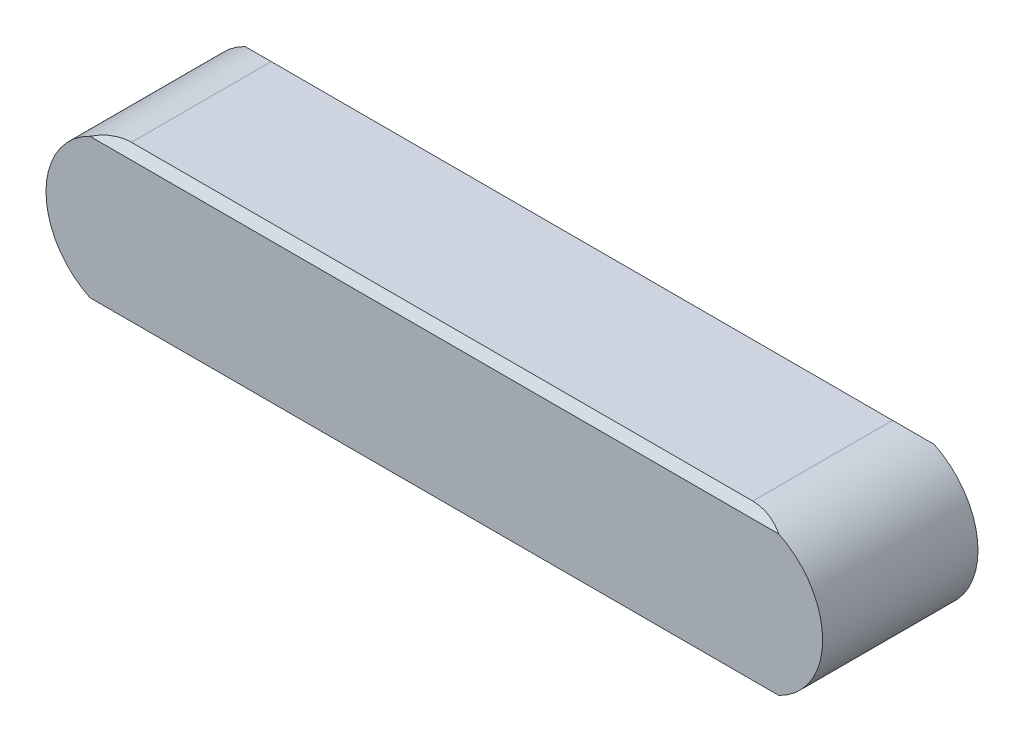
ISO-10303-21;
HEADER;
FILE_DESCRIPTION(('STEP AP214'),'2;1');
FILE_NAME('part.step','',(''),(''),'','','');
FILE_SCHEMA(('AUTOMOTIVE_DESIGN { 1 0 10303 214 1 1 1 1 }'));
ENDSEC;
DATA;
#1=APPLICATION_CONTEXT('core data for automotive mechanical design processes');
#2=APPLICATION_PROTOCOL_DEFINITION('international standard','automotive_design',2000,#1);
#3=PRODUCT_CONTEXT('',#1,'mechanical');
#4=PRODUCT('Part','Part','',(#3));
#5=PRODUCT_RELATED_PRODUCT_CATEGORY('part','',(#4));
#6=PRODUCT_DEFINITION_FORMATION('','',#4);
#7=PRODUCT_DEFINITION_CONTEXT('part definition',#1,'design');
#8=PRODUCT_DEFINITION('design','',#6,#7);
#9=PRODUCT_DEFINITION_SHAPE('','',#8);
#10=(LENGTH_UNIT() NAMED_UNIT(*) SI_UNIT(.MILLI.,.METRE.));
#11=(NAMED_UNIT(*) PLANE_ANGLE_UNIT() SI_UNIT($,.RADIAN.));
#12=(NAMED_UNIT(*) SI_UNIT($,.STERADIAN.) SOLID_ANGLE_UNIT());
#13=UNCERTAINTY_MEASURE_WITH_UNIT(LENGTH_MEASURE(1.E-05),#10,'distance_accuracy_value','');
#14=(GEOMETRIC_REPRESENTATION_CONTEXT(3) GLOBAL_UNCERTAINTY_ASSIGNED_CONTEXT((#13)) GLOBAL_UNIT_ASSIGNED_CONTEXT((#10,
#11,#12)) REPRESENTATION_CONTEXT('',''));
#15=CARTESIAN_POINT('',(0.,0.,0.));
#16=DIRECTION('',(0.,0.,1.));
#17=DIRECTION('',(1.,0.,0.));
#18=AXIS2_PLACEMENT_3D('',#15,#16,#17);
#19=CARTESIAN_POINT('',(0.,3.8,0.));
#20=DIRECTION('',(0.,-0.707106781186547,0.707106781186548));
#21=DIRECTION('',(0.,-0.707106781186548,-0.707106781186547));
#22=AXIS2_PLACEMENT_3D('',#19,#20,#21);
#23=PLANE('',#22);
#24=DIRECTION('',(1.,0.,0.));
#25=VECTOR('',#24,1.);
#26=CARTESIAN_POINT('',(0.,3.8,0.));
#27=LINE('',#26,#25);
#28=CARTESIAN_POINT('',(18.8717797887081,3.8,0.));
#29=VERTEX_POINT('',#28);
#30=CARTESIAN_POINT('',(1.12822021129187,3.8,0.));
#31=VERTEX_POINT('',#30);
#32=EDGE_CURVE('E91',#29,#31,#27,.F.);
#33=ORIENTED_EDGE('',*,*,#32,.T.);
#34=CARTESIAN_POINT('',(2.,2.,-1.8));
#35=DIRECTION('',(0.,-0.707106781186547,0.707106781186548));
#36=DIRECTION('',(0.,-0.707106781186548,-0.707106781186547));
#37=AXIS2_PLACEMENT_3D('',#34,#35,#36);
#38=ELLIPSE('',#37,2.82842712474619,2.);
#39=CARTESIAN_POINT('',(2.,4.,0.2));
#40=VERTEX_POINT('',#39);
#41=EDGE_CURVE('E20',#40,#31,#38,.T.);
#42=ORIENTED_EDGE('',*,*,#41,.F.);
#43=DIRECTION('',(1.,0.,0.));
#44=VECTOR('',#43,1.);
#45=CARTESIAN_POINT('',(2.,4.,0.2));
#46=LINE('',#45,#44);
#47=CARTESIAN_POINT('',(18.,4.,0.2));
#48=VERTEX_POINT('',#47);
#49=EDGE_CURVE('E96',#48,#40,#46,.F.);
#50=ORIENTED_EDGE('',*,*,#49,.F.);
#51=CARTESIAN_POINT('',(18.,2.,-1.8));
#52=DIRECTION('',(0.,-0.707106781186547,0.707106781186548));
#53=DIRECTION('',(0.,-0.707106781186548,-0.707106781186547));
#54=AXIS2_PLACEMENT_3D('',#51,#52,#53);
#55=ELLIPSE('',#54,2.82842712474619,2.);
#56=EDGE_CURVE('E89',#29,#48,#55,.T.);
#57=ORIENTED_EDGE('',*,*,#56,.F.);
#58=EDGE_LOOP('',(#33,#42,#50,#57));
#59=FACE_BOUND('',#58,.T.);
#60=ADVANCED_FACE('F17',(#59),#23,.F.);
#61=CARTESIAN_POINT('',(0.,0.,0.2));
#62=DIRECTION('',(0.,0.707106781186548,0.707106781186547));
#63=DIRECTION('',(0.,-0.707106781186547,0.707106781186548));
#64=AXIS2_PLACEMENT_3D('',#61,#62,#63);
#65=PLANE('',#64);
#66=DIRECTION('',(1.,0.,0.));
#67=VECTOR('',#66,1.);
#68=CARTESIAN_POINT('',(18.,0.,0.2));
#69=LINE('',#68,#67);
#70=CARTESIAN_POINT('',(2.,0.,0.2));
#71=VERTEX_POINT('',#70);
#72=CARTESIAN_POINT('',(18.,0.,0.2));
#73=VERTEX_POINT('',#72);
#74=EDGE_CURVE('E142',#71,#73,#69,.T.);
#75=ORIENTED_EDGE('',*,*,#74,.F.);
#76=CARTESIAN_POINT('',(2.,2.,-1.8));
#77=DIRECTION('',(0.,0.707106781186548,0.707106781186547));
#78=DIRECTION('',(0.,0.707106781186547,-0.707106781186548));
#79=AXIS2_PLACEMENT_3D('',#76,#77,#78);
#80=ELLIPSE('',#79,2.82842712474619,2.);
#81=CARTESIAN_POINT('',(1.12822021129187,0.2,0.));
#82=VERTEX_POINT('',#81);
#83=EDGE_CURVE('E127',#82,#71,#80,.T.);
#84=ORIENTED_EDGE('',*,*,#83,.F.);
#85=DIRECTION('',(1.,0.,0.));
#86=VECTOR('',#85,1.);
#87=CARTESIAN_POINT('',(0.,0.2,0.));
#88=LINE('',#87,#86);
#89=CARTESIAN_POINT('',(18.8717797887081,0.2,0.));
#90=VERTEX_POINT('',#89);
#91=EDGE_CURVE('E95',#82,#90,#88,.T.);
#92=ORIENTED_EDGE('',*,*,#91,.T.);
#93=CARTESIAN_POINT('',(18.,2.,-1.8));
#94=DIRECTION('',(0.,0.707106781186548,0.707106781186547));
#95=DIRECTION('',(0.,0.707106781186547,-0.707106781186548));
#96=AXIS2_PLACEMENT_3D('',#93,#94,#95);
#97=ELLIPSE('',#96,2.82842712474619,2.);
#98=EDGE_CURVE('E125',#73,#90,#97,.T.);
#99=ORIENTED_EDGE('',*,*,#98,.F.);
#100=EDGE_LOOP('',(#75,#84,#92,#99));
#101=FACE_BOUND('',#100,.T.);
#102=ADVANCED_FACE('F147',(#101),#65,.F.);
#103=CARTESIAN_POINT('',(2.,4.,0.));
#104=DIRECTION('',(0.,1.,0.));
#105=DIRECTION('',(0.,0.,1.));
#106=AXIS2_PLACEMENT_3D('',#103,#104,#105);
#107=PLANE('',#106);
#108=ORIENTED_EDGE('',*,*,#49,.T.);
#109=DIRECTION('',(0.,0.,-1.));
#110=VECTOR('',#109,1.);
#111=CARTESIAN_POINT('',(2.,4.,0.));
#112=LINE('',#111,#110);
#113=CARTESIAN_POINT('',(2.,4.,3.8));
#114=VERTEX_POINT('',#113);
#115=EDGE_CURVE('E88',#114,#40,#112,.T.);
#116=ORIENTED_EDGE('',*,*,#115,.F.);
#117=DIRECTION('',(1.,0.,0.));
#118=VECTOR('',#117,1.);
#119=CARTESIAN_POINT('',(0.,4.,3.8));
#120=LINE('',#119,#118);
#121=CARTESIAN_POINT('',(18.,4.,3.8));
#122=VERTEX_POINT('',#121);
#123=EDGE_CURVE('E116',#114,#122,#120,.T.);
#124=ORIENTED_EDGE('',*,*,#123,.T.);
#125=DIRECTION('',(0.,0.,-1.));
#126=VECTOR('',#125,1.);
#127=CARTESIAN_POINT('',(18.,4.,0.));
#128=LINE('',#127,#126);
#129=EDGE_CURVE('E119',#48,#122,#128,.F.);
#130=ORIENTED_EDGE('',*,*,#129,.F.);
#131=EDGE_LOOP('',(#108,#116,#124,#130));
#132=FACE_BOUND('',#131,.T.);
#133=ADVANCED_FACE('F135',(#132),#107,.T.);
#134=CARTESIAN_POINT('',(0.,0.,0.));
#135=DIRECTION('',(0.,0.,1.));
#136=DIRECTION('',(1.,0.,0.));
#137=AXIS2_PLACEMENT_3D('',#134,#135,#136);
#138=PLANE('',#137);
#139=CARTESIAN_POINT('',(2.,2.,0.));
#140=DIRECTION('',(0.,0.,-1.));
#141=DIRECTION('',(-1.,0.,0.));
#142=AXIS2_PLACEMENT_3D('',#139,#140,#141);
#143=CIRCLE('',#142,2.);
#144=EDGE_CURVE('E86',#31,#82,#143,.F.);
#145=ORIENTED_EDGE('',*,*,#144,.F.);
#146=ORIENTED_EDGE('',*,*,#32,.F.);
#147=CARTESIAN_POINT('',(18.,2.,0.));
#148=DIRECTION('',(0.,0.,-1.));
#149=DIRECTION('',(-1.,0.,0.));
#150=AXIS2_PLACEMENT_3D('',#147,#148,#149);
#151=CIRCLE('',#150,2.);
#152=EDGE_CURVE('E117',#90,#29,#151,.F.);
#153=ORIENTED_EDGE('',*,*,#152,.F.);
#154=ORIENTED_EDGE('',*,*,#91,.F.);
#155=EDGE_LOOP('',(#145,#146,#153,#154));
#156=FACE_BOUND('',#155,.T.);
#157=ADVANCED_FACE('F99',(#156),#138,.F.);
#158=CARTESIAN_POINT('',(18.,0.,0.));
#159=DIRECTION('',(0.,-1.,0.));
#160=DIRECTION('',(0.,0.,-1.));
#161=AXIS2_PLACEMENT_3D('',#158,#159,#160);
#162=PLANE('',#161);
#163=ORIENTED_EDGE('',*,*,#74,.T.);
#164=DIRECTION('',(0.,0.,-1.));
#165=VECTOR('',#164,1.);
#166=CARTESIAN_POINT('',(18.,0.,0.));
#167=LINE('',#166,#165);
#168=CARTESIAN_POINT('',(18.,0.,3.8));
#169=VERTEX_POINT('',#168);
#170=EDGE_CURVE('E120',#169,#73,#167,.T.);
#171=ORIENTED_EDGE('',*,*,#170,.F.);
#172=DIRECTION('',(1.,0.,0.));
#173=VECTOR('',#172,1.);
#174=CARTESIAN_POINT('',(0.,0.,3.8));
#175=LINE('',#174,#173);
#176=CARTESIAN_POINT('',(2.,0.,3.8));
#177=VERTEX_POINT('',#176);
#178=EDGE_CURVE('E124',#169,#177,#175,.F.);
#179=ORIENTED_EDGE('',*,*,#178,.T.);
#180=DIRECTION('',(0.,0.,-1.));
#181=VECTOR('',#180,1.);
#182=CARTESIAN_POINT('',(2.,0.,0.));
#183=LINE('',#182,#181);
#184=EDGE_CURVE('E101',#71,#177,#183,.F.);
#185=ORIENTED_EDGE('',*,*,#184,.F.);
#186=EDGE_LOOP('',(#163,#171,#179,#185));
#187=FACE_BOUND('',#186,.T.);
#188=ADVANCED_FACE('F151',(#187),#162,.T.);
#189=CARTESIAN_POINT('',(0.,0.2,4.));
#190=DIRECTION('',(0.,0.707106781186548,-0.707106781186548));
#191=DIRECTION('',(0.,0.707106781186548,0.707106781186548));
#192=AXIS2_PLACEMENT_3D('',#189,#190,#191);
#193=PLANE('',#192);
#194=DIRECTION('',(1.,0.,0.));
#195=VECTOR('',#194,1.);
#196=CARTESIAN_POINT('',(0.,0.2,4.));
#197=LINE('',#196,#195);
#198=CARTESIAN_POINT('',(1.12822021129187,0.2,4.));
#199=VERTEX_POINT('',#198);
#200=CARTESIAN_POINT('',(18.8717797887081,0.2,4.));
#201=VERTEX_POINT('',#200);
#202=EDGE_CURVE('E104',#199,#201,#197,.T.);
#203=ORIENTED_EDGE('',*,*,#202,.F.);
#204=CARTESIAN_POINT('',(2.,2.,5.8));
#205=DIRECTION('',(0.,0.707106781186548,-0.707106781186548));
#206=DIRECTION('',(0.,-0.707106781186548,-0.707106781186548));
#207=AXIS2_PLACEMENT_3D('',#204,#205,#206);
#208=ELLIPSE('',#207,2.82842712474619,2.);
#209=EDGE_CURVE('E111',#177,#199,#208,.T.);
#210=ORIENTED_EDGE('',*,*,#209,.F.);
#211=ORIENTED_EDGE('',*,*,#178,.F.);
#212=CARTESIAN_POINT('',(18.,2.,5.8));
#213=DIRECTION('',(0.,0.707106781186548,-0.707106781186548));
#214=DIRECTION('',(0.,-0.707106781186548,-0.707106781186548));
#215=AXIS2_PLACEMENT_3D('',#212,#213,#214);
#216=ELLIPSE('',#215,2.82842712474619,2.);
#217=EDGE_CURVE('E121',#201,#169,#216,.T.);
#218=ORIENTED_EDGE('',*,*,#217,.F.);
#219=EDGE_LOOP('',(#203,#210,#211,#218));
#220=FACE_BOUND('',#219,.T.);
#221=ADVANCED_FACE('F154',(#220),#193,.F.);
#222=CARTESIAN_POINT('',(18.,2.,0.));
#223=DIRECTION('',(0.,0.,-1.));
#224=DIRECTION('',(-1.,0.,0.));
#225=AXIS2_PLACEMENT_3D('',#222,#223,#224);
#226=CYLINDRICAL_SURFACE('',#225,2.);
#227=CARTESIAN_POINT('',(18.,2.,5.8));
#228=DIRECTION('',(0.,-0.707106781186548,-0.707106781186548));
#229=DIRECTION('',(0.,0.707106781186548,-0.707106781186548));
#230=AXIS2_PLACEMENT_3D('',#227,#228,#229);
#231=ELLIPSE('',#230,2.82842712474619,2.);
#232=CARTESIAN_POINT('',(18.8717797887081,3.8,4.));
#233=VERTEX_POINT('',#232);
#234=EDGE_CURVE('E114',#122,#233,#231,.T.);
#235=ORIENTED_EDGE('',*,*,#234,.T.);
#236=CARTESIAN_POINT('',(18.,2.,4.));
#237=DIRECTION('',(0.,0.,-1.));
#238=DIRECTION('',(-1.,0.,0.));
#239=AXIS2_PLACEMENT_3D('',#236,#237,#238);
#240=CIRCLE('',#239,2.);
#241=EDGE_CURVE('E109',#201,#233,#240,.F.);
#242=ORIENTED_EDGE('',*,*,#241,.F.);
#243=ORIENTED_EDGE('',*,*,#217,.T.);
#244=ORIENTED_EDGE('',*,*,#170,.T.);
#245=ORIENTED_EDGE('',*,*,#98,.T.);
#246=ORIENTED_EDGE('',*,*,#152,.T.);
#247=ORIENTED_EDGE('',*,*,#56,.T.);
#248=ORIENTED_EDGE('',*,*,#129,.T.);
#249=EDGE_LOOP('',(#235,#242,#243,#244,#245,#246,#247,#248));
#250=FACE_BOUND('',#249,.T.);
#251=ADVANCED_FACE('F130',(#250),#226,.T.);
#252=CARTESIAN_POINT('',(0.,4.,3.8));
#253=DIRECTION('',(0.,-0.707106781186548,-0.707106781186548));
#254=DIRECTION('',(0.,0.707106781186548,-0.707106781186548));
#255=AXIS2_PLACEMENT_3D('',#252,#253,#254);
#256=PLANE('',#255);
#257=ORIENTED_EDGE('',*,*,#123,.F.);
#258=CARTESIAN_POINT('',(2.,2.,5.8));
#259=DIRECTION('',(0.,-0.707106781186548,-0.707106781186548));
#260=DIRECTION('',(0.,0.707106781186548,-0.707106781186548));
#261=AXIS2_PLACEMENT_3D('',#258,#259,#260);
#262=ELLIPSE('',#261,2.82842712474619,2.);
#263=CARTESIAN_POINT('',(1.12822021129187,3.8,4.));
#264=VERTEX_POINT('',#263);
#265=EDGE_CURVE('E35',#264,#114,#262,.T.);
#266=ORIENTED_EDGE('',*,*,#265,.F.);
#267=DIRECTION('',(1.,0.,0.));
#268=VECTOR('',#267,1.);
#269=CARTESIAN_POINT('',(0.,3.8,4.));
#270=LINE('',#269,#268);
#271=EDGE_CURVE('E26',#233,#264,#270,.F.);
#272=ORIENTED_EDGE('',*,*,#271,.F.);
#273=ORIENTED_EDGE('',*,*,#234,.F.);
#274=EDGE_LOOP('',(#257,#266,#272,#273));
#275=FACE_BOUND('',#274,.T.);
#276=ADVANCED_FACE('F163',(#275),#256,.F.);
#277=CARTESIAN_POINT('',(2.,2.,0.));
#278=DIRECTION('',(0.,0.,-1.));
#279=DIRECTION('',(-1.,0.,0.));
#280=AXIS2_PLACEMENT_3D('',#277,#278,#279);
#281=CYLINDRICAL_SURFACE('',#280,2.);
#282=ORIENTED_EDGE('',*,*,#83,.T.);
#283=ORIENTED_EDGE('',*,*,#184,.T.);
#284=ORIENTED_EDGE('',*,*,#209,.T.);
#285=CARTESIAN_POINT('',(2.,2.,4.));
#286=DIRECTION('',(0.,0.,-1.));
#287=DIRECTION('',(-1.,0.,0.));
#288=AXIS2_PLACEMENT_3D('',#285,#286,#287);
#289=CIRCLE('',#288,2.);
#290=EDGE_CURVE('E11',#264,#199,#289,.F.);
#291=ORIENTED_EDGE('',*,*,#290,.F.);
#292=ORIENTED_EDGE('',*,*,#265,.T.);
#293=ORIENTED_EDGE('',*,*,#115,.T.);
#294=ORIENTED_EDGE('',*,*,#41,.T.);
#295=ORIENTED_EDGE('',*,*,#144,.T.);
#296=EDGE_LOOP('',(#282,#283,#284,#291,#292,#293,#294,#295));
#297=FACE_BOUND('',#296,.T.);
#298=ADVANCED_FACE('F84',(#297),#281,.T.);
#299=CARTESIAN_POINT('',(0.,0.,4.));
#300=DIRECTION('',(0.,0.,1.));
#301=DIRECTION('',(1.,0.,0.));
#302=AXIS2_PLACEMENT_3D('',#299,#300,#301);
#303=PLANE('',#302);
#304=ORIENTED_EDGE('',*,*,#271,.T.);
#305=ORIENTED_EDGE('',*,*,#290,.T.);
#306=ORIENTED_EDGE('',*,*,#202,.T.);
#307=ORIENTED_EDGE('',*,*,#241,.T.);
#308=EDGE_LOOP('',(#304,#305,#306,#307));
#309=FACE_BOUND('',#308,.T.);
#310=ADVANCED_FACE('F162',(#309),#303,.T.);
#311=CLOSED_SHELL('',(#60,#102,#133,#157,#188,#221,#251,#276,#298,#310));
#312=MANIFOLD_SOLID_BREP('B1',#311);
#313=ADVANCED_BREP_SHAPE_REPRESENTATION('',(#18,#312),#14);
#314=SHAPE_DEFINITION_REPRESENTATION(#9,#313);
ENDSEC;
END-ISO-10303-21;
